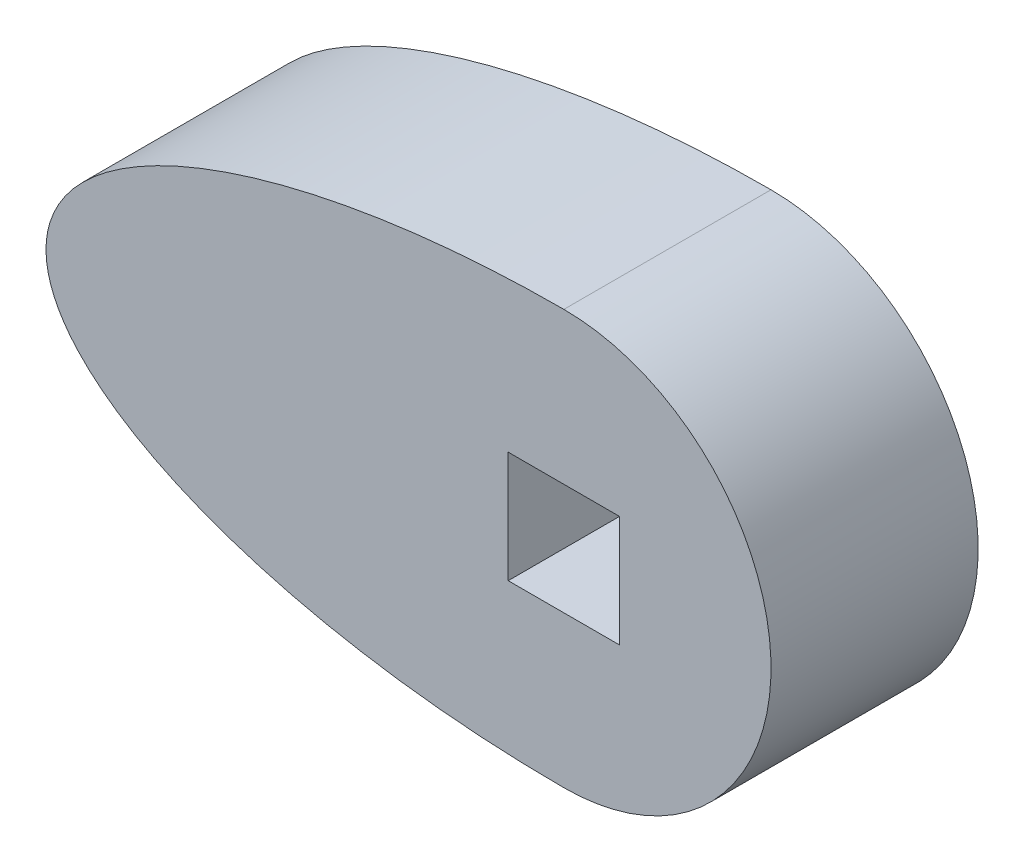
ISO-10303-21;
HEADER;
FILE_DESCRIPTION(('STEP AP214'),'2;1');
FILE_NAME('part.step','',(''),(''),'','','');
FILE_SCHEMA(('AUTOMOTIVE_DESIGN { 1 0 10303 214 1 1 1 1 }'));
ENDSEC;
DATA;
#1=APPLICATION_CONTEXT('core data for automotive mechanical design processes');
#2=APPLICATION_PROTOCOL_DEFINITION('international standard','automotive_design',2000,#1);
#3=PRODUCT_CONTEXT('',#1,'mechanical');
#4=PRODUCT('Part','Part','',(#3));
#5=PRODUCT_RELATED_PRODUCT_CATEGORY('part','',(#4));
#6=PRODUCT_DEFINITION_FORMATION('','',#4);
#7=PRODUCT_DEFINITION_CONTEXT('part definition',#1,'design');
#8=PRODUCT_DEFINITION('design','',#6,#7);
#9=PRODUCT_DEFINITION_SHAPE('','',#8);
#10=(LENGTH_UNIT() NAMED_UNIT(*) SI_UNIT(.MILLI.,.METRE.));
#11=(NAMED_UNIT(*) PLANE_ANGLE_UNIT() SI_UNIT($,.RADIAN.));
#12=(NAMED_UNIT(*) SI_UNIT($,.STERADIAN.) SOLID_ANGLE_UNIT());
#13=UNCERTAINTY_MEASURE_WITH_UNIT(LENGTH_MEASURE(1.E-05),#10,'distance_accuracy_value','');
#14=(GEOMETRIC_REPRESENTATION_CONTEXT(3) GLOBAL_UNCERTAINTY_ASSIGNED_CONTEXT((#13)) GLOBAL_UNIT_ASSIGNED_CONTEXT((#10,
#11,#12)) REPRESENTATION_CONTEXT('',''));
#15=CARTESIAN_POINT('',(0.,0.,0.));
#16=DIRECTION('',(0.,0.,1.));
#17=DIRECTION('',(1.,0.,0.));
#18=AXIS2_PLACEMENT_3D('',#15,#16,#17);
#19=CARTESIAN_POINT('',(0.,0.,-10.));
#20=DIRECTION('',(0.,0.,1.));
#21=DIRECTION('',(1.,0.,0.));
#22=AXIS2_PLACEMENT_3D('',#19,#20,#21);
#23=CYLINDRICAL_SURFACE('',#22,10.);
#24=CARTESIAN_POINT('',(0.,0.,0.));
#25=DIRECTION('',(0.,0.,1.));
#26=DIRECTION('',(1.,0.,0.));
#27=AXIS2_PLACEMENT_3D('',#24,#25,#26);
#28=CIRCLE('',#27,10.);
#29=CARTESIAN_POINT('',(0.,-10.,0.));
#30=VERTEX_POINT('',#29);
#31=CARTESIAN_POINT('',(0.,10.,0.));
#32=VERTEX_POINT('',#31);
#33=EDGE_CURVE('E125',#30,#32,#28,.T.);
#34=ORIENTED_EDGE('',*,*,#33,.F.);
#35=DIRECTION('',(0.,0.,1.));
#36=VECTOR('',#35,1.);
#37=CARTESIAN_POINT('',(0.,-10.,-10.));
#38=LINE('',#37,#36);
#39=CARTESIAN_POINT('',(0.,-10.,-10.));
#40=VERTEX_POINT('',#39);
#41=EDGE_CURVE('E119',#40,#30,#38,.T.);
#42=ORIENTED_EDGE('',*,*,#41,.F.);
#43=CARTESIAN_POINT('',(0.,0.,-10.));
#44=DIRECTION('',(0.,0.,1.));
#45=DIRECTION('',(1.,0.,0.));
#46=AXIS2_PLACEMENT_3D('',#43,#44,#45);
#47=CIRCLE('',#46,10.);
#48=CARTESIAN_POINT('',(0.,10.,-10.));
#49=VERTEX_POINT('',#48);
#50=EDGE_CURVE('E126',#40,#49,#47,.T.);
#51=ORIENTED_EDGE('',*,*,#50,.T.);
#52=DIRECTION('',(0.,0.,1.));
#53=VECTOR('',#52,1.);
#54=CARTESIAN_POINT('',(0.,10.,-10.));
#55=LINE('',#54,#53);
#56=EDGE_CURVE('E11',#49,#32,#55,.T.);
#57=ORIENTED_EDGE('',*,*,#56,.T.);
#58=EDGE_LOOP('',(#34,#42,#51,#57));
#59=FACE_BOUND('',#58,.T.);
#60=ADVANCED_FACE('F37',(#59),#23,.T.);
#61=CARTESIAN_POINT('',(0.,0.,-10.));
#62=DIRECTION('',(0.,0.,1.));
#63=DIRECTION('',(-1.,0.,0.));
#64=AXIS2_PLACEMENT_3D('',#61,#62,#63);
#65=ELLIPSE('',#64,25.,10.);
#66=DIRECTION('',(0.,0.,1.));
#67=VECTOR('',#66,1.);
#68=SURFACE_OF_LINEAR_EXTRUSION('',#65,#67);
#69=CARTESIAN_POINT('',(0.,0.,0.));
#70=DIRECTION('',(0.,0.,1.));
#71=DIRECTION('',(-1.,0.,0.));
#72=AXIS2_PLACEMENT_3D('',#69,#70,#71);
#73=ELLIPSE('',#72,25.,10.);
#74=EDGE_CURVE('E129',#32,#30,#73,.T.);
#75=ORIENTED_EDGE('',*,*,#74,.F.);
#76=ORIENTED_EDGE('',*,*,#56,.F.);
#77=EDGE_CURVE('E44',#49,#40,#65,.T.);
#78=ORIENTED_EDGE('',*,*,#77,.T.);
#79=ORIENTED_EDGE('',*,*,#41,.T.);
#80=EDGE_LOOP('',(#75,#76,#78,#79));
#81=FACE_BOUND('',#80,.T.);
#82=ADVANCED_FACE('F132',(#81),#68,.T.);
#83=CARTESIAN_POINT('',(0.,0.,-10.));
#84=DIRECTION('',(0.,0.,1.));
#85=DIRECTION('',(1.,0.,0.));
#86=AXIS2_PLACEMENT_3D('',#83,#84,#85);
#87=PLANE('',#86);
#88=DIRECTION('',(-1.,0.,0.));
#89=VECTOR('',#88,1.);
#90=CARTESIAN_POINT('',(2.68700576850888,-2.68700576850888,-10.));
#91=LINE('',#90,#89);
#92=CARTESIAN_POINT('',(2.68700576850888,-2.68700576850888,-10.));
#93=VERTEX_POINT('',#92);
#94=CARTESIAN_POINT('',(-2.68700576850888,-2.68700576850888,-10.));
#95=VERTEX_POINT('',#94);
#96=EDGE_CURVE('E93',#93,#95,#91,.T.);
#97=ORIENTED_EDGE('',*,*,#96,.F.);
#98=DIRECTION('',(0.,1.,0.));
#99=VECTOR('',#98,1.);
#100=CARTESIAN_POINT('',(2.68700576850888,-2.68700576850888,-10.));
#101=LINE('',#100,#99);
#102=CARTESIAN_POINT('',(2.68700576850888,2.68700576850888,-10.));
#103=VERTEX_POINT('',#102);
#104=EDGE_CURVE('E90',#93,#103,#101,.T.);
#105=ORIENTED_EDGE('',*,*,#104,.T.);
#106=DIRECTION('',(-1.,0.,0.));
#107=VECTOR('',#106,1.);
#108=CARTESIAN_POINT('',(2.68700576850888,2.68700576850888,-10.));
#109=LINE('',#108,#107);
#110=CARTESIAN_POINT('',(-2.68700576850888,2.68700576850888,-10.));
#111=VERTEX_POINT('',#110);
#112=EDGE_CURVE('E96',#103,#111,#109,.T.);
#113=ORIENTED_EDGE('',*,*,#112,.T.);
#114=DIRECTION('',(0.,1.,0.));
#115=VECTOR('',#114,1.);
#116=CARTESIAN_POINT('',(-2.68700576850888,-2.68700576850888,-10.));
#117=LINE('',#116,#115);
#118=EDGE_CURVE('E100',#95,#111,#117,.T.);
#119=ORIENTED_EDGE('',*,*,#118,.F.);
#120=EDGE_LOOP('',(#97,#105,#113,#119));
#121=FACE_BOUND('',#120,.T.);
#122=ORIENTED_EDGE('',*,*,#50,.F.);
#123=ORIENTED_EDGE('',*,*,#77,.F.);
#124=EDGE_LOOP('',(#122,#123));
#125=FACE_BOUND('',#124,.T.);
#126=ADVANCED_FACE('F102',(#121,#125),#87,.F.);
#127=CARTESIAN_POINT('',(0.,0.,0.));
#128=DIRECTION('',(0.,0.,1.));
#129=DIRECTION('',(1.,0.,0.));
#130=AXIS2_PLACEMENT_3D('',#127,#128,#129);
#131=PLANE('',#130);
#132=DIRECTION('',(0.,1.,0.));
#133=VECTOR('',#132,1.);
#134=CARTESIAN_POINT('',(2.68700576850888,-2.68700576850888,0.));
#135=LINE('',#134,#133);
#136=CARTESIAN_POINT('',(2.68700576850888,-2.68700576850888,0.));
#137=VERTEX_POINT('',#136);
#138=CARTESIAN_POINT('',(2.68700576850888,2.68700576850888,0.));
#139=VERTEX_POINT('',#138);
#140=EDGE_CURVE('E59',#137,#139,#135,.T.);
#141=ORIENTED_EDGE('',*,*,#140,.F.);
#142=DIRECTION('',(-1.,0.,0.));
#143=VECTOR('',#142,1.);
#144=CARTESIAN_POINT('',(2.68700576850888,-2.68700576850888,0.));
#145=LINE('',#144,#143);
#146=CARTESIAN_POINT('',(-2.68700576850888,-2.68700576850888,0.));
#147=VERTEX_POINT('',#146);
#148=EDGE_CURVE('E104',#137,#147,#145,.T.);
#149=ORIENTED_EDGE('',*,*,#148,.T.);
#150=DIRECTION('',(0.,1.,0.));
#151=VECTOR('',#150,1.);
#152=CARTESIAN_POINT('',(-2.68700576850888,-2.68700576850888,0.));
#153=LINE('',#152,#151);
#154=CARTESIAN_POINT('',(-2.68700576850888,2.68700576850888,0.));
#155=VERTEX_POINT('',#154);
#156=EDGE_CURVE('E107',#147,#155,#153,.T.);
#157=ORIENTED_EDGE('',*,*,#156,.T.);
#158=DIRECTION('',(-1.,0.,0.));
#159=VECTOR('',#158,1.);
#160=CARTESIAN_POINT('',(2.68700576850888,2.68700576850888,0.));
#161=LINE('',#160,#159);
#162=EDGE_CURVE('E113',#139,#155,#161,.T.);
#163=ORIENTED_EDGE('',*,*,#162,.F.);
#164=EDGE_LOOP('',(#141,#149,#157,#163));
#165=FACE_BOUND('',#164,.T.);
#166=ORIENTED_EDGE('',*,*,#33,.T.);
#167=ORIENTED_EDGE('',*,*,#74,.T.);
#168=EDGE_LOOP('',(#166,#167));
#169=FACE_BOUND('',#168,.T.);
#170=ADVANCED_FACE('F136',(#165,#169),#131,.T.);
#171=CARTESIAN_POINT('',(2.68700576850888,-2.68700576850888,-10.));
#172=DIRECTION('',(1.,0.,0.));
#173=DIRECTION('',(0.,0.,-1.));
#174=AXIS2_PLACEMENT_3D('',#171,#172,#173);
#175=PLANE('',#174);
#176=ORIENTED_EDGE('',*,*,#140,.T.);
#177=DIRECTION('',(0.,0.,1.));
#178=VECTOR('',#177,1.);
#179=CARTESIAN_POINT('',(2.68700576850888,2.68700576850888,-10.));
#180=LINE('',#179,#178);
#181=EDGE_CURVE('E87',#103,#139,#180,.T.);
#182=ORIENTED_EDGE('',*,*,#181,.F.);
#183=ORIENTED_EDGE('',*,*,#104,.F.);
#184=DIRECTION('',(0.,0.,1.));
#185=VECTOR('',#184,1.);
#186=CARTESIAN_POINT('',(2.68700576850888,-2.68700576850888,-10.));
#187=LINE('',#186,#185);
#188=EDGE_CURVE('E117',#93,#137,#187,.T.);
#189=ORIENTED_EDGE('',*,*,#188,.T.);
#190=EDGE_LOOP('',(#176,#182,#183,#189));
#191=FACE_BOUND('',#190,.T.);
#192=ADVANCED_FACE('F88',(#191),#175,.F.);
#193=CARTESIAN_POINT('',(2.68700576850888,-2.68700576850888,-10.));
#194=DIRECTION('',(0.,1.,0.));
#195=DIRECTION('',(-1.,0.,0.));
#196=AXIS2_PLACEMENT_3D('',#193,#194,#195);
#197=PLANE('',#196);
#198=ORIENTED_EDGE('',*,*,#148,.F.);
#199=ORIENTED_EDGE('',*,*,#188,.F.);
#200=ORIENTED_EDGE('',*,*,#96,.T.);
#201=DIRECTION('',(0.,0.,1.));
#202=VECTOR('',#201,1.);
#203=CARTESIAN_POINT('',(-2.68700576850888,-2.68700576850888,-10.));
#204=LINE('',#203,#202);
#205=EDGE_CURVE('E120',#95,#147,#204,.T.);
#206=ORIENTED_EDGE('',*,*,#205,.T.);
#207=EDGE_LOOP('',(#198,#199,#200,#206));
#208=FACE_BOUND('',#207,.T.);
#209=ADVANCED_FACE('F144',(#208),#197,.T.);
#210=CARTESIAN_POINT('',(-2.68700576850888,-2.68700576850888,-10.));
#211=DIRECTION('',(1.,0.,0.));
#212=DIRECTION('',(0.,0.,-1.));
#213=AXIS2_PLACEMENT_3D('',#210,#211,#212);
#214=PLANE('',#213);
#215=ORIENTED_EDGE('',*,*,#156,.F.);
#216=ORIENTED_EDGE('',*,*,#205,.F.);
#217=ORIENTED_EDGE('',*,*,#118,.T.);
#218=DIRECTION('',(0.,0.,1.));
#219=VECTOR('',#218,1.);
#220=CARTESIAN_POINT('',(-2.68700576850888,2.68700576850888,-10.));
#221=LINE('',#220,#219);
#222=EDGE_CURVE('E51',#111,#155,#221,.T.);
#223=ORIENTED_EDGE('',*,*,#222,.T.);
#224=EDGE_LOOP('',(#215,#216,#217,#223));
#225=FACE_BOUND('',#224,.T.);
#226=ADVANCED_FACE('F147',(#225),#214,.T.);
#227=CARTESIAN_POINT('',(2.68700576850888,2.68700576850888,-10.));
#228=DIRECTION('',(0.,1.,0.));
#229=DIRECTION('',(-1.,0.,0.));
#230=AXIS2_PLACEMENT_3D('',#227,#228,#229);
#231=PLANE('',#230);
#232=ORIENTED_EDGE('',*,*,#162,.T.);
#233=ORIENTED_EDGE('',*,*,#222,.F.);
#234=ORIENTED_EDGE('',*,*,#112,.F.);
#235=ORIENTED_EDGE('',*,*,#181,.T.);
#236=EDGE_LOOP('',(#232,#233,#234,#235));
#237=FACE_BOUND('',#236,.T.);
#238=ADVANCED_FACE('F97',(#237),#231,.F.);
#239=CLOSED_SHELL('',(#60,#82,#126,#170,#192,#209,#226,#238));
#240=MANIFOLD_SOLID_BREP('B2',#239);
#241=ADVANCED_BREP_SHAPE_REPRESENTATION('',(#18,#240),#14);
#242=SHAPE_DEFINITION_REPRESENTATION(#9,#241);
ENDSEC;
END-ISO-10303-21;
